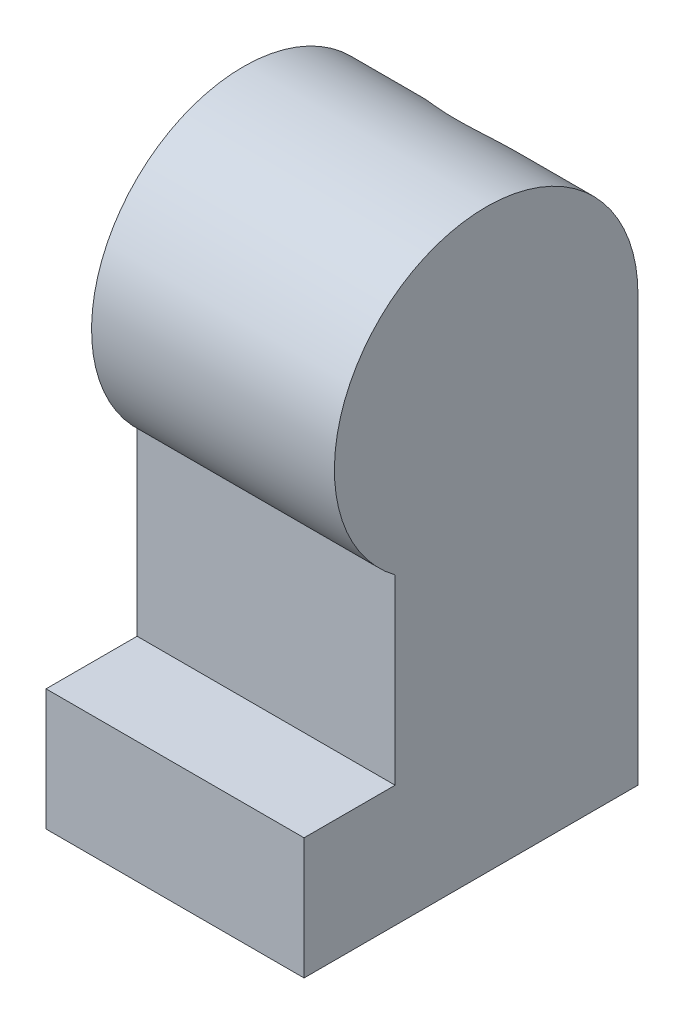
ISO-10303-21;
HEADER;
FILE_DESCRIPTION(('STEP AP214'),'2;1');
FILE_NAME('part.step','',(''),(''),'','','');
FILE_SCHEMA(('AUTOMOTIVE_DESIGN { 1 0 10303 214 1 1 1 1 }'));
ENDSEC;
DATA;
#1=APPLICATION_CONTEXT('core data for automotive mechanical design processes');
#2=APPLICATION_PROTOCOL_DEFINITION('international standard','automotive_design',2000,#1);
#3=PRODUCT_CONTEXT('',#1,'mechanical');
#4=PRODUCT('Part','Part','',(#3));
#5=PRODUCT_RELATED_PRODUCT_CATEGORY('part','',(#4));
#6=PRODUCT_DEFINITION_FORMATION('','',#4);
#7=PRODUCT_DEFINITION_CONTEXT('part definition',#1,'design');
#8=PRODUCT_DEFINITION('design','',#6,#7);
#9=PRODUCT_DEFINITION_SHAPE('','',#8);
#10=(LENGTH_UNIT() NAMED_UNIT(*) SI_UNIT(.MILLI.,.METRE.));
#11=(NAMED_UNIT(*) PLANE_ANGLE_UNIT() SI_UNIT($,.RADIAN.));
#12=(NAMED_UNIT(*) SI_UNIT($,.STERADIAN.) SOLID_ANGLE_UNIT());
#13=UNCERTAINTY_MEASURE_WITH_UNIT(LENGTH_MEASURE(1.E-05),#10,'distance_accuracy_value','');
#14=(GEOMETRIC_REPRESENTATION_CONTEXT(3) GLOBAL_UNCERTAINTY_ASSIGNED_CONTEXT((#13)) GLOBAL_UNIT_ASSIGNED_CONTEXT((#10,
#11,#12)) REPRESENTATION_CONTEXT('',''));
#15=CARTESIAN_POINT('',(0.,0.,0.));
#16=DIRECTION('',(0.,0.,1.));
#17=DIRECTION('',(1.,0.,0.));
#18=AXIS2_PLACEMENT_3D('',#15,#16,#17);
#19=CARTESIAN_POINT('',(1.190625,15.08325,-2.38125));
#20=DIRECTION('',(0.,0.,1.));
#21=DIRECTION('',(1.,0.,0.));
#22=AXIS2_PLACEMENT_3D('',#19,#20,#21);
#23=PLANE('',#22);
#24=DIRECTION('',(0.,1.,0.));
#25=VECTOR('',#24,1.);
#26=CARTESIAN_POINT('',(2.778125,9.66118596973271,-2.38125));
#27=LINE('',#26,#25);
#28=CARTESIAN_POINT('',(2.778125,9.66118596973271,-2.38125));
#29=VERTEX_POINT('',#28);
#30=CARTESIAN_POINT('',(2.778125,14.1513140302673,-2.38125));
#31=VERTEX_POINT('',#30);
#32=EDGE_CURVE('E167',#29,#31,#27,.T.);
#33=ORIENTED_EDGE('',*,*,#32,.F.);
#34=CARTESIAN_POINT('',(3.571875,11.90625,-2.38125));
#35=DIRECTION('',(0.,0.,1.));
#36=DIRECTION('',(1.,0.,0.));
#37=AXIS2_PLACEMENT_3D('',#34,#35,#36);
#38=CIRCLE('',#37,2.38125000000001);
#39=EDGE_CURVE('E161',#29,#31,#38,.F.);
#40=ORIENTED_EDGE('',*,*,#39,.T.);
#41=EDGE_LOOP('',(#33,#40));
#42=FACE_BOUND('',#41,.T.);
#43=ADVANCED_FACE('F37',(#42),#23,.F.);
#44=CARTESIAN_POINT('',(1.190625,15.08325,-2.38125));
#45=DIRECTION('',(0.,0.,1.));
#46=DIRECTION('',(1.,0.,0.));
#47=AXIS2_PLACEMENT_3D('',#44,#45,#46);
#48=PLANE('',#47);
#49=CARTESIAN_POINT('',(3.571875,3.96875,-2.38125));
#50=DIRECTION('',(0.,0.,1.));
#51=DIRECTION('',(1.,0.,0.));
#52=AXIS2_PLACEMENT_3D('',#49,#50,#51);
#53=CIRCLE('',#52,2.38125);
#54=CARTESIAN_POINT('',(5.953125,3.96875,-2.38125));
#55=VERTEX_POINT('',#54);
#56=CARTESIAN_POINT('',(1.190625,3.96875,-2.38125));
#57=VERTEX_POINT('',#56);
#58=EDGE_CURVE('E12',#55,#57,#53,.T.);
#59=ORIENTED_EDGE('',*,*,#58,.F.);
#60=DIRECTION('',(0.,-1.,0.));
#61=VECTOR('',#60,1.);
#62=CARTESIAN_POINT('',(5.953125,15.08325,-2.38125));
#63=LINE('',#62,#61);
#64=CARTESIAN_POINT('',(5.953125,7.67546167873052,-2.38125000000001));
#65=VERTEX_POINT('',#64);
#66=EDGE_CURVE('E251',#65,#55,#63,.T.);
#67=ORIENTED_EDGE('',*,*,#66,.F.);
#68=DIRECTION('',(1.,0.,0.));
#69=VECTOR('',#68,1.);
#70=CARTESIAN_POINT('',(-10.8284451513364,7.67546167873052,-2.38125000000001));
#71=LINE('',#70,#69);
#72=CARTESIAN_POINT('',(1.190625,7.67546167873052,-2.38125));
#73=VERTEX_POINT('',#72);
#74=EDGE_CURVE('E192',#73,#65,#71,.T.);
#75=ORIENTED_EDGE('',*,*,#74,.F.);
#76=DIRECTION('',(0.,-1.,0.));
#77=VECTOR('',#76,1.);
#78=CARTESIAN_POINT('',(1.190625,15.08325,-2.38125));
#79=LINE('',#78,#77);
#80=EDGE_CURVE('E282',#73,#57,#79,.T.);
#81=ORIENTED_EDGE('',*,*,#80,.T.);
#82=EDGE_LOOP('',(#59,#67,#75,#81));
#83=FACE_BOUND('',#82,.T.);
#84=ADVANCED_FACE('F206',(#83),#48,.T.);
#85=CARTESIAN_POINT('',(-11.2253201513364,11.1125,-0.396874999999999));
#86=DIRECTION('',(1.,0.,0.));
#87=DIRECTION('',(0.,0.,-1.));
#88=AXIS2_PLACEMENT_3D('',#85,#86,#87);
#89=CYLINDRICAL_SURFACE('',#88,3.96875);
#90=CARTESIAN_POINT('',(1.32681096973271,11.1125,-4.365625));
#91=CARTESIAN_POINT('',(1.30701755525374,11.1684542487782,-4.36563495142378));
#92=CARTESIAN_POINT('',(1.28933418573402,11.2251567426196,-4.36444187589844));
#93=CARTESIAN_POINT('',(1.25826719656662,11.339615668586,-4.35953264570903));
#94=CARTESIAN_POINT('',(1.2448832691343,11.3973720249551,-4.3558166717113));
#95=CARTESIAN_POINT('',(1.22253803103019,11.5132653525563,-4.34576537472123));
#96=CARTESIAN_POINT('',(1.21355875029495,11.5713997800275,-4.33944089181621));
#97=CARTESIAN_POINT('',(1.19994008150046,11.68780993877,-4.32414497095028));
#98=CARTESIAN_POINT('',(1.19530050429691,11.7460856637718,-4.31517364837326));
#99=CARTESIAN_POINT('',(1.18783402252553,11.9205011039694,-4.28428932674348));
#100=CARTESIAN_POINT('',(1.19144682230573,12.0362954200456,-4.25840032621934));
#101=CARTESIAN_POINT('',(1.21480133281904,12.2635264169128,-4.19687828490391));
#102=CARTESIAN_POINT('',(1.23455316803175,12.3749603162937,-4.1612391369035));
#103=CARTESIAN_POINT('',(1.28945780546674,12.594878206545,-4.08031480120449));
#104=CARTESIAN_POINT('',(1.32512164870348,12.7031253464996,-4.03473759885851));
#105=CARTESIAN_POINT('',(1.40995842608976,12.910772929603,-3.93670525741914));
#106=CARTESIAN_POINT('',(1.45913444185718,13.0101713478367,-3.884248550798));
#107=CARTESIAN_POINT('',(1.57850828121833,13.2151339018736,-3.76528729185824));
#108=CARTESIAN_POINT('',(1.65084913136497,13.3189326446407,-3.69790269036965));
#109=CARTESIAN_POINT('',(1.8097757049671,13.5128380361569,-3.55971381274583));
#110=CARTESIAN_POINT('',(1.89639328803208,13.6029131743021,-3.48890214433307));
#111=CARTESIAN_POINT('',(2.04503270465009,13.7350768823537,-3.37635143782159));
#112=CARTESIAN_POINT('',(2.1028373332676,13.7818412968881,-3.33443489445976));
#113=CARTESIAN_POINT('',(2.22314076494899,13.8701336363607,-3.25171092436964));
#114=CARTESIAN_POINT('',(2.28564167761434,13.911659185256,-3.2109040074379));
#115=CARTESIAN_POINT('',(2.41522685178416,13.98908449684,-3.13170532815867));
#116=CARTESIAN_POINT('',(2.48229935284518,14.0249979664163,-3.09330782298671));
#117=CARTESIAN_POINT('',(2.62123402300634,14.0908637875129,-3.02037206915601));
#118=CARTESIAN_POINT('',(2.69309124281277,14.1208221748982,-2.98582992857089));
#119=CARTESIAN_POINT('',(2.8475670512362,14.1762671053601,-2.9200281156823));
#120=CARTESIAN_POINT('',(2.93058753935312,14.2012168561875,-2.88924005750429));
#121=CARTESIAN_POINT('',(3.10166067161263,14.2422625358819,-2.83750297370962));
#122=CARTESIAN_POINT('',(3.18970215569316,14.2583773156041,-2.8165330136554));
#123=CARTESIAN_POINT('',(3.37018005290364,14.2806970263171,-2.78724525807482));
#124=CARTESIAN_POINT('',(3.46265288221283,14.2867962238212,-2.77906249883042));
#125=CARTESIAN_POINT('',(3.64782240088153,14.2880875326372,-2.77734248857693));
#126=CARTESIAN_POINT('',(3.74051907887779,14.283280186437,-2.78380450914133));
#127=CARTESIAN_POINT('',(3.9119398229629,14.2644843582118,-2.80854588253211));
#128=CARTESIAN_POINT('',(3.99102190241361,14.2516462481256,-2.82534073482566));
#129=CARTESIAN_POINT('',(4.14536649071659,14.2187583541195,-2.86726909307836));
#130=CARTESIAN_POINT('',(4.22062549115162,14.1987020778502,-2.89241010437086));
#131=CARTESIAN_POINT('',(4.41491912867954,14.1369086837694,-2.96739228283316));
#132=CARTESIAN_POINT('',(4.53009220373622,14.089596197385,-3.02258860505556));
#133=CARTESIAN_POINT('',(4.7484218209142,13.9801551686941,-3.14170959287202));
#134=CARTESIAN_POINT('',(4.85153633106603,13.9179769750056,-3.20566319517299));
#135=CARTESIAN_POINT('',(5.01113575176531,13.8048570233376,-3.3133696473234));
#136=CARTESIAN_POINT('',(5.07110844847499,13.7578494344151,-3.35616718956509));
#137=CARTESIAN_POINT('',(5.18615961786883,13.6584557082274,-3.44210253914183));
#138=CARTESIAN_POINT('',(5.24123664209993,13.6060679889914,-3.48524044309471));
#139=CARTESIAN_POINT('',(5.3987969941357,13.4411122764214,-3.61368535655438));
#140=CARTESIAN_POINT('',(5.49387346962105,13.3205644315129,-3.69820896743568));
#141=CARTESIAN_POINT('',(5.64558468177028,13.0835635829583,-3.84384143135618));
#142=CARTESIAN_POINT('',(5.70607404999784,12.9704414438622,-3.90639638612007));
#143=CARTESIAN_POINT('',(5.809146855791,12.7319391129767,-4.02259929427164));
#144=CARTESIAN_POINT('',(5.85174641472338,12.6065700835947,-4.0762552404816));
#145=CARTESIAN_POINT('',(5.9000444298798,12.4108054268426,-4.14791656174465));
#146=CARTESIAN_POINT('',(5.91357250663917,12.3438963897962,-4.17042700331695));
#147=CARTESIAN_POINT('',(5.93490653945093,12.2081513519553,-4.21204852034721));
#148=CARTESIAN_POINT('',(5.9427157240873,12.1393164612206,-4.23116150920455));
#149=CARTESIAN_POINT('',(5.9522831482818,12.0003538391527,-4.26570110143064));
#150=CARTESIAN_POINT('',(5.95404522641276,11.9302269563855,-4.28113003756639));
#151=CARTESIAN_POINT('',(5.9512989945741,11.7893928936788,-4.30813263003261));
#152=CARTESIAN_POINT('',(5.94679319797398,11.7186859576363,-4.31970782937556));
#153=CARTESIAN_POINT('',(5.92919483451744,11.5574140038843,-4.34166513075442));
#154=CARTESIAN_POINT('',(5.91403523758213,11.4668847895153,-4.35078531060102));
#155=CARTESIAN_POINT('',(5.88345670776998,11.3326119670545,-4.35977224461627));
#156=CARTESIAN_POINT('',(5.87194857599804,11.2880830053145,-4.36198558791466));
#157=CARTESIAN_POINT('',(5.84636132242703,11.1997253376775,-4.36491246473769));
#158=CARTESIAN_POINT('',(5.83228251038636,11.1558965481034,-4.36562617883319));
#159=CARTESIAN_POINT('',(5.81693903026729,11.1125,-4.365625));
#160=B_SPLINE_CURVE_WITH_KNOTS('',3,(#90,#91,#92,#93,#94,#95,#96,#97,#98,#99,#100,#101,#102,
#103,#104,#105,#106,#107,#108,#109,#110,#111,#112,#113,#114,#115,#116,#117,#118,#119,#120,#121,
#122,#123,#124,#125,#126,#127,#128,#129,#130,#131,#132,#133,#134,#135,#136,#137,#138,#139,#140,
#141,#142,#143,#144,#145,#146,#147,#148,#149,#150,#151,#152,#153,#154,#155,#156,#157,#158,#159),
.UNSPECIFIED.,.F.,.F.,(4,2,2,2,2,2,2,2,2,2,2,2,2,2,2,2,2,2,2,2,2,2,2,2,2,2,2,2,2,2,2,2,2,2,4),
(0.,0.178003936551981,0.355995127474543,0.533253982525169,0.710505111457348,1.06480679321033,
1.4193309093656,1.78616738421233,2.15308759018841,2.58159393935689,3.01106981153157,
3.2668813061563,3.52280840797637,3.77810032248523,4.03313214757179,4.30821568372511,
4.58270997704483,4.86008387357856,5.13744397392907,5.38207395783397,5.62692452531978,
6.03324709638796,6.44094622281295,6.70283852114437,6.96480804783826,7.48764136400289,
7.91423378942165,8.3404409626894,8.55579968810129,8.77103673944507,8.98613713765132,
9.20115130711372,9.47693752858245,9.614987519328,9.75302088647394),.UNSPECIFIED.);
#161=CARTESIAN_POINT('',(1.32681096973271,11.1125,-4.365625));
#162=VERTEX_POINT('',#161);
#163=CARTESIAN_POINT('',(5.81693903026729,11.1125,-4.365625));
#164=VERTEX_POINT('',#163);
#165=EDGE_CURVE('E59',#162,#164,#160,.T.);
#166=ORIENTED_EDGE('',*,*,#165,.F.);
#167=DIRECTION('',(-1.,0.,0.));
#168=VECTOR('',#167,1.);
#169=CARTESIAN_POINT('',(6.746875,11.1125,-4.365625));
#170=LINE('',#169,#168);
#171=CARTESIAN_POINT('',(0.396874999999998,11.1125,-4.365625));
#172=VERTEX_POINT('',#171);
#173=EDGE_CURVE('E348',#162,#172,#170,.T.);
#174=ORIENTED_EDGE('',*,*,#173,.T.);
#175=CARTESIAN_POINT('',(0.396875,11.1125,-0.396874999999999));
#176=DIRECTION('',(-1.,0.,0.));
#177=DIRECTION('',(0.,0.,1.));
#178=AXIS2_PLACEMENT_3D('',#175,#176,#177);
#179=CIRCLE('',#178,3.96875);
#180=CARTESIAN_POINT('',(0.396875,7.9375,1.984375));
#181=VERTEX_POINT('',#180);
#182=EDGE_CURVE('E45',#172,#181,#179,.F.);
#183=ORIENTED_EDGE('',*,*,#182,.T.);
#184=DIRECTION('',(1.,0.,0.));
#185=VECTOR('',#184,1.);
#186=CARTESIAN_POINT('',(-11.2253201513364,7.9375,1.984375));
#187=LINE('',#186,#185);
#188=CARTESIAN_POINT('',(6.746875,7.9375,1.984375));
#189=VERTEX_POINT('',#188);
#190=EDGE_CURVE('E310',#189,#181,#187,.F.);
#191=ORIENTED_EDGE('',*,*,#190,.F.);
#192=CARTESIAN_POINT('',(6.746875,11.1125,-0.396874999999999));
#193=DIRECTION('',(1.,0.,0.));
#194=DIRECTION('',(0.,0.,-1.));
#195=AXIS2_PLACEMENT_3D('',#192,#193,#194);
#196=CIRCLE('',#195,3.96875);
#197=CARTESIAN_POINT('',(6.746875,11.1125,-4.365625));
#198=VERTEX_POINT('',#197);
#199=EDGE_CURVE('E303',#198,#189,#196,.T.);
#200=ORIENTED_EDGE('',*,*,#199,.F.);
#201=EDGE_CURVE('E344',#198,#164,#170,.T.);
#202=ORIENTED_EDGE('',*,*,#201,.T.);
#203=EDGE_LOOP('',(#166,#174,#183,#191,#200,#202));
#204=FACE_BOUND('',#203,.T.);
#205=ADVANCED_FACE('F194',(#204),#89,.T.);
#206=CARTESIAN_POINT('',(6.746875,0.,4.365625));
#207=DIRECTION('',(0.,1.,0.));
#208=DIRECTION('',(0.,0.,1.));
#209=AXIS2_PLACEMENT_3D('',#206,#207,#208);
#210=PLANE('',#209);
#211=DIRECTION('',(1.,0.,0.));
#212=VECTOR('',#211,1.);
#213=CARTESIAN_POINT('',(5.953125,0.,2.38125));
#214=LINE('',#213,#212);
#215=CARTESIAN_POINT('',(1.190625,0.,2.38125));
#216=VERTEX_POINT('',#215);
#217=CARTESIAN_POINT('',(5.953125,0.,2.38125));
#218=VERTEX_POINT('',#217);
#219=EDGE_CURVE('E274',#216,#218,#214,.T.);
#220=ORIENTED_EDGE('',*,*,#219,.T.);
#221=DIRECTION('',(0.,0.,-1.));
#222=VECTOR('',#221,1.);
#223=CARTESIAN_POINT('',(5.953125,0.,0.));
#224=LINE('',#223,#222);
#225=CARTESIAN_POINT('',(5.953125,0.,-2.38125));
#226=VERTEX_POINT('',#225);
#227=EDGE_CURVE('E273',#218,#226,#224,.T.);
#228=ORIENTED_EDGE('',*,*,#227,.T.);
#229=DIRECTION('',(-1.,0.,0.));
#230=VECTOR('',#229,1.);
#231=CARTESIAN_POINT('',(1.190625,0.,-2.38125));
#232=LINE('',#231,#230);
#233=CARTESIAN_POINT('',(1.190625,0.,-2.38125));
#234=VERTEX_POINT('',#233);
#235=EDGE_CURVE('E270',#226,#234,#232,.T.);
#236=ORIENTED_EDGE('',*,*,#235,.T.);
#237=DIRECTION('',(0.,0.,1.));
#238=VECTOR('',#237,1.);
#239=CARTESIAN_POINT('',(1.190625,0.,2.38125));
#240=LINE('',#239,#238);
#241=EDGE_CURVE('E277',#234,#216,#240,.T.);
#242=ORIENTED_EDGE('',*,*,#241,.T.);
#243=EDGE_LOOP('',(#220,#228,#236,#242));
#244=FACE_BOUND('',#243,.T.);
#245=DIRECTION('',(0.,0.,-1.));
#246=VECTOR('',#245,1.);
#247=CARTESIAN_POINT('',(0.,0.,4.365625));
#248=LINE('',#247,#246);
#249=CARTESIAN_POINT('',(0.,0.,4.365625));
#250=VERTEX_POINT('',#249);
#251=CARTESIAN_POINT('',(0.,0.,-4.365625));
#252=VERTEX_POINT('',#251);
#253=EDGE_CURVE('E330',#250,#252,#248,.T.);
#254=ORIENTED_EDGE('',*,*,#253,.T.);
#255=DIRECTION('',(-1.,0.,0.));
#256=VECTOR('',#255,1.);
#257=CARTESIAN_POINT('',(6.746875,0.,-4.365625));
#258=LINE('',#257,#256);
#259=CARTESIAN_POINT('',(6.746875,0.,-4.365625));
#260=VERTEX_POINT('',#259);
#261=EDGE_CURVE('E347',#260,#252,#258,.T.);
#262=ORIENTED_EDGE('',*,*,#261,.F.);
#263=DIRECTION('',(0.,0.,-1.));
#264=VECTOR('',#263,1.);
#265=CARTESIAN_POINT('',(6.746875,0.,4.365625));
#266=LINE('',#265,#264);
#267=CARTESIAN_POINT('',(6.746875,0.,4.365625));
#268=VERTEX_POINT('',#267);
#269=EDGE_CURVE('E317',#268,#260,#266,.T.);
#270=ORIENTED_EDGE('',*,*,#269,.F.);
#271=DIRECTION('',(-1.,0.,0.));
#272=VECTOR('',#271,1.);
#273=CARTESIAN_POINT('',(6.746875,0.,4.365625));
#274=LINE('',#273,#272);
#275=EDGE_CURVE('E351',#268,#250,#274,.T.);
#276=ORIENTED_EDGE('',*,*,#275,.T.);
#277=EDGE_LOOP('',(#254,#262,#270,#276));
#278=FACE_BOUND('',#277,.T.);
#279=ADVANCED_FACE('F380',(#244,#278),#210,.F.);
#280=CARTESIAN_POINT('',(6.746875,0.,4.365625));
#281=DIRECTION('',(0.,0.,-1.));
#282=DIRECTION('',(-1.,0.,0.));
#283=AXIS2_PLACEMENT_3D('',#280,#281,#282);
#284=PLANE('',#283);
#285=DIRECTION('',(0.,-1.,0.));
#286=VECTOR('',#285,1.);
#287=CARTESIAN_POINT('',(0.,0.,4.365625));
#288=LINE('',#287,#286);
#289=CARTESIAN_POINT('',(0.,3.175,4.365625));
#290=VERTEX_POINT('',#289);
#291=EDGE_CURVE('E313',#290,#250,#288,.T.);
#292=ORIENTED_EDGE('',*,*,#291,.T.);
#293=ORIENTED_EDGE('',*,*,#275,.F.);
#294=DIRECTION('',(0.,-1.,0.));
#295=VECTOR('',#294,1.);
#296=CARTESIAN_POINT('',(6.746875,0.,4.365625));
#297=LINE('',#296,#295);
#298=CARTESIAN_POINT('',(6.746875,3.175,4.365625));
#299=VERTEX_POINT('',#298);
#300=EDGE_CURVE('E314',#299,#268,#297,.T.);
#301=ORIENTED_EDGE('',*,*,#300,.F.);
#302=DIRECTION('',(-1.,0.,0.));
#303=VECTOR('',#302,1.);
#304=CARTESIAN_POINT('',(6.746875,3.175,4.365625));
#305=LINE('',#304,#303);
#306=EDGE_CURVE('E327',#299,#290,#305,.T.);
#307=ORIENTED_EDGE('',*,*,#306,.T.);
#308=EDGE_LOOP('',(#292,#293,#301,#307));
#309=FACE_BOUND('',#308,.T.);
#310=ADVANCED_FACE('F39',(#309),#284,.F.);
#311=CARTESIAN_POINT('',(6.746875,11.1125,-4.365625));
#312=DIRECTION('',(0.,0.,1.));
#313=DIRECTION('',(0.,-1.,0.));
#314=AXIS2_PLACEMENT_3D('',#311,#312,#313);
#315=PLANE('',#314);
#316=CARTESIAN_POINT('',(3.571875,3.96875,-4.365625));
#317=DIRECTION('',(0.,0.,-1.));
#318=DIRECTION('',(0.,1.,0.));
#319=AXIS2_PLACEMENT_3D('',#316,#317,#318);
#320=CIRCLE('',#319,2.38125);
#321=CARTESIAN_POINT('',(3.571875,6.35,-4.365625));
#322=VERTEX_POINT('',#321);
#323=EDGE_CURVE('E177',#322,#322,#320,.T.);
#324=ORIENTED_EDGE('',*,*,#323,.F.);
#325=EDGE_LOOP('',(#324));
#326=FACE_BOUND('',#325,.T.);
#327=ORIENTED_EDGE('',*,*,#173,.F.);
#328=CARTESIAN_POINT('',(3.571875,11.90625,-4.365625));
#329=DIRECTION('',(0.,0.,-1.));
#330=DIRECTION('',(0.,1.,0.));
#331=AXIS2_PLACEMENT_3D('',#328,#329,#330);
#332=CIRCLE('',#331,2.38125000000001);
#333=EDGE_CURVE('E175',#164,#162,#332,.T.);
#334=ORIENTED_EDGE('',*,*,#333,.F.);
#335=ORIENTED_EDGE('',*,*,#201,.F.);
#336=DIRECTION('',(0.,1.,0.));
#337=VECTOR('',#336,1.);
#338=CARTESIAN_POINT('',(6.746875,11.1125,-4.365625));
#339=LINE('',#338,#337);
#340=EDGE_CURVE('E320',#260,#198,#339,.T.);
#341=ORIENTED_EDGE('',*,*,#340,.F.);
#342=ORIENTED_EDGE('',*,*,#261,.T.);
#343=DIRECTION('',(0.,1.,0.));
#344=VECTOR('',#343,1.);
#345=CARTESIAN_POINT('',(0.,11.1125,-4.365625));
#346=LINE('',#345,#344);
#347=CARTESIAN_POINT('',(0.,11.1125,-4.365625));
#348=VERTEX_POINT('',#347);
#349=EDGE_CURVE('E332',#252,#348,#346,.T.);
#350=ORIENTED_EDGE('',*,*,#349,.T.);
#351=EDGE_CURVE('E343',#172,#348,#170,.T.);
#352=ORIENTED_EDGE('',*,*,#351,.F.);
#353=EDGE_LOOP('',(#327,#334,#335,#341,#342,#350,#352));
#354=FACE_BOUND('',#353,.T.);
#355=ADVANCED_FACE('F372',(#326,#354),#315,.F.);
#356=CARTESIAN_POINT('',(6.746875,3.175,1.984375));
#357=DIRECTION('',(0.,0.,-1.));
#358=DIRECTION('',(-1.,0.,0.));
#359=AXIS2_PLACEMENT_3D('',#356,#357,#358);
#360=PLANE('',#359);
#361=DIRECTION('',(0.,-1.,0.));
#362=VECTOR('',#361,1.);
#363=CARTESIAN_POINT('',(6.746875,3.175,1.984375));
#364=LINE('',#363,#362);
#365=CARTESIAN_POINT('',(6.746875,3.175,1.984375));
#366=VERTEX_POINT('',#365);
#367=EDGE_CURVE('E323',#189,#366,#364,.T.);
#368=ORIENTED_EDGE('',*,*,#367,.F.);
#369=ORIENTED_EDGE('',*,*,#190,.T.);
#370=CARTESIAN_POINT('',(0.,7.9375,1.984375));
#371=VERTEX_POINT('',#370);
#372=EDGE_CURVE('E309',#181,#371,#187,.F.);
#373=ORIENTED_EDGE('',*,*,#372,.T.);
#374=DIRECTION('',(0.,-1.,0.));
#375=VECTOR('',#374,1.);
#376=CARTESIAN_POINT('',(0.,3.175,1.984375));
#377=LINE('',#376,#375);
#378=CARTESIAN_POINT('',(0.,3.175,1.984375));
#379=VERTEX_POINT('',#378);
#380=EDGE_CURVE('E335',#371,#379,#377,.T.);
#381=ORIENTED_EDGE('',*,*,#380,.T.);
#382=DIRECTION('',(-1.,0.,0.));
#383=VECTOR('',#382,1.);
#384=CARTESIAN_POINT('',(6.746875,3.175,1.984375));
#385=LINE('',#384,#383);
#386=EDGE_CURVE('E340',#366,#379,#385,.T.);
#387=ORIENTED_EDGE('',*,*,#386,.F.);
#388=EDGE_LOOP('',(#368,#369,#373,#381,#387));
#389=FACE_BOUND('',#388,.T.);
#390=ADVANCED_FACE('F361',(#389),#360,.F.);
#391=CARTESIAN_POINT('',(6.746875,3.175,4.365625));
#392=DIRECTION('',(0.,-1.,0.));
#393=DIRECTION('',(0.,0.,-1.));
#394=AXIS2_PLACEMENT_3D('',#391,#392,#393);
#395=PLANE('',#394);
#396=DIRECTION('',(0.,0.,1.));
#397=VECTOR('',#396,1.);
#398=CARTESIAN_POINT('',(0.,3.175,4.365625));
#399=LINE('',#398,#397);
#400=EDGE_CURVE('E318',#379,#290,#399,.T.);
#401=ORIENTED_EDGE('',*,*,#400,.T.);
#402=ORIENTED_EDGE('',*,*,#306,.F.);
#403=DIRECTION('',(0.,0.,1.));
#404=VECTOR('',#403,1.);
#405=CARTESIAN_POINT('',(6.746875,3.175,4.365625));
#406=LINE('',#405,#404);
#407=EDGE_CURVE('E325',#366,#299,#406,.T.);
#408=ORIENTED_EDGE('',*,*,#407,.F.);
#409=ORIENTED_EDGE('',*,*,#386,.T.);
#410=EDGE_LOOP('',(#401,#402,#408,#409));
#411=FACE_BOUND('',#410,.T.);
#412=ADVANCED_FACE('F386',(#411),#395,.F.);
#413=CARTESIAN_POINT('',(6.746875,0.,0.));
#414=DIRECTION('',(-1.,0.,0.));
#415=DIRECTION('',(0.,0.,1.));
#416=AXIS2_PLACEMENT_3D('',#413,#414,#415);
#417=PLANE('',#416);
#418=ORIENTED_EDGE('',*,*,#340,.T.);
#419=ORIENTED_EDGE('',*,*,#199,.T.);
#420=ORIENTED_EDGE('',*,*,#367,.T.);
#421=ORIENTED_EDGE('',*,*,#407,.T.);
#422=ORIENTED_EDGE('',*,*,#300,.T.);
#423=ORIENTED_EDGE('',*,*,#269,.T.);
#424=EDGE_LOOP('',(#418,#419,#420,#421,#422,#423));
#425=FACE_BOUND('',#424,.T.);
#426=ADVANCED_FACE('F367',(#425),#417,.F.);
#427=CARTESIAN_POINT('',(0.,0.,0.));
#428=DIRECTION('',(-1.,0.,0.));
#429=DIRECTION('',(0.,0.,1.));
#430=AXIS2_PLACEMENT_3D('',#427,#428,#429);
#431=PLANE('',#430);
#432=CARTESIAN_POINT('',(0.,11.1125,-0.396874999999999));
#433=DIRECTION('',(-1.,0.,0.));
#434=DIRECTION('',(0.,0.,1.));
#435=AXIS2_PLACEMENT_3D('',#432,#433,#434);
#436=CIRCLE('',#435,3.96875);
#437=EDGE_CURVE('E264',#348,#371,#436,.T.);
#438=ORIENTED_EDGE('',*,*,#437,.F.);
#439=ORIENTED_EDGE('',*,*,#349,.F.);
#440=ORIENTED_EDGE('',*,*,#253,.F.);
#441=ORIENTED_EDGE('',*,*,#291,.F.);
#442=ORIENTED_EDGE('',*,*,#400,.F.);
#443=ORIENTED_EDGE('',*,*,#380,.F.);
#444=EDGE_LOOP('',(#438,#439,#440,#441,#442,#443));
#445=FACE_BOUND('',#444,.T.);
#446=ADVANCED_FACE('F237',(#445),#431,.T.);
#447=CARTESIAN_POINT('',(6.746875,3.175,1.190625));
#448=DIRECTION('',(0.,0.,-1.));
#449=DIRECTION('',(-1.,0.,0.));
#450=AXIS2_PLACEMENT_3D('',#447,#448,#449);
#451=PLANE('',#450);
#452=DIRECTION('',(1.,0.,0.));
#453=VECTOR('',#452,1.);
#454=CARTESIAN_POINT('',(-10.8284451513364,7.4750805421288,1.190625));
#455=LINE('',#454,#453);
#456=CARTESIAN_POINT('',(5.953125,7.4750805421288,1.190625));
#457=VERTEX_POINT('',#456);
#458=CARTESIAN_POINT('',(1.190625,7.4750805421288,1.190625));
#459=VERTEX_POINT('',#458);
#460=EDGE_CURVE('E255',#457,#459,#455,.F.);
#461=ORIENTED_EDGE('',*,*,#460,.F.);
#462=DIRECTION('',(0.,-1.,0.));
#463=VECTOR('',#462,1.);
#464=CARTESIAN_POINT('',(5.953125,0.,1.190625));
#465=LINE('',#464,#463);
#466=CARTESIAN_POINT('',(5.953125,2.38125,1.190625));
#467=VERTEX_POINT('',#466);
#468=EDGE_CURVE('E253',#457,#467,#465,.T.);
#469=ORIENTED_EDGE('',*,*,#468,.T.);
#470=DIRECTION('',(-1.,0.,0.));
#471=VECTOR('',#470,1.);
#472=CARTESIAN_POINT('',(6.746875,2.38125,1.190625));
#473=LINE('',#472,#471);
#474=CARTESIAN_POINT('',(1.190625,2.38125,1.190625));
#475=VERTEX_POINT('',#474);
#476=EDGE_CURVE('E300',#467,#475,#473,.T.);
#477=ORIENTED_EDGE('',*,*,#476,.T.);
#478=DIRECTION('',(0.,1.,0.));
#479=VECTOR('',#478,1.);
#480=CARTESIAN_POINT('',(1.190625,15.08325,1.190625));
#481=LINE('',#480,#479);
#482=EDGE_CURVE('E292',#475,#459,#481,.T.);
#483=ORIENTED_EDGE('',*,*,#482,.T.);
#484=EDGE_LOOP('',(#461,#469,#477,#483));
#485=FACE_BOUND('',#484,.T.);
#486=ADVANCED_FACE('F233',(#485),#451,.T.);
#487=CARTESIAN_POINT('',(6.746875,2.38125,4.365625));
#488=DIRECTION('',(0.,-1.,0.));
#489=DIRECTION('',(0.,0.,-1.));
#490=AXIS2_PLACEMENT_3D('',#487,#488,#489);
#491=PLANE('',#490);
#492=DIRECTION('',(-1.,0.,0.));
#493=VECTOR('',#492,1.);
#494=CARTESIAN_POINT('',(5.953125,2.38125,2.38125));
#495=LINE('',#494,#493);
#496=CARTESIAN_POINT('',(5.953125,2.38125,2.38125));
#497=VERTEX_POINT('',#496);
#498=CARTESIAN_POINT('',(1.190625,2.38125,2.38125));
#499=VERTEX_POINT('',#498);
#500=EDGE_CURVE('E269',#497,#499,#495,.T.);
#501=ORIENTED_EDGE('',*,*,#500,.T.);
#502=DIRECTION('',(0.,0.,-1.));
#503=VECTOR('',#502,1.);
#504=CARTESIAN_POINT('',(1.190625,2.38125,2.38125));
#505=LINE('',#504,#503);
#506=EDGE_CURVE('E289',#499,#475,#505,.T.);
#507=ORIENTED_EDGE('',*,*,#506,.T.);
#508=ORIENTED_EDGE('',*,*,#476,.F.);
#509=DIRECTION('',(0.,0.,1.));
#510=VECTOR('',#509,1.);
#511=CARTESIAN_POINT('',(5.953125,2.38125,0.));
#512=LINE('',#511,#510);
#513=EDGE_CURVE('E297',#467,#497,#512,.T.);
#514=ORIENTED_EDGE('',*,*,#513,.T.);
#515=EDGE_LOOP('',(#501,#507,#508,#514));
#516=FACE_BOUND('',#515,.T.);
#517=ADVANCED_FACE('F236',(#516),#491,.T.);
#518=CARTESIAN_POINT('',(5.953125,0.,0.));
#519=DIRECTION('',(-1.,0.,0.));
#520=DIRECTION('',(0.,0.,1.));
#521=AXIS2_PLACEMENT_3D('',#518,#519,#520);
#522=PLANE('',#521);
#523=CARTESIAN_POINT('',(5.953125,11.1125,-0.396874999999999));
#524=DIRECTION('',(-1.,0.,0.));
#525=DIRECTION('',(0.,0.,1.));
#526=AXIS2_PLACEMENT_3D('',#523,#524,#525);
#527=CIRCLE('',#526,3.96875);
#528=EDGE_CURVE('E249',#65,#457,#527,.T.);
#529=ORIENTED_EDGE('',*,*,#528,.F.);
#530=ORIENTED_EDGE('',*,*,#66,.T.);
#531=EDGE_CURVE('E281',#55,#226,#63,.T.);
#532=ORIENTED_EDGE('',*,*,#531,.T.);
#533=ORIENTED_EDGE('',*,*,#227,.F.);
#534=DIRECTION('',(0.,-1.,0.));
#535=VECTOR('',#534,1.);
#536=CARTESIAN_POINT('',(5.953125,15.08325,2.38125));
#537=LINE('',#536,#535);
#538=EDGE_CURVE('E286',#497,#218,#537,.T.);
#539=ORIENTED_EDGE('',*,*,#538,.F.);
#540=ORIENTED_EDGE('',*,*,#513,.F.);
#541=ORIENTED_EDGE('',*,*,#468,.F.);
#542=EDGE_LOOP('',(#529,#530,#532,#533,#539,#540,#541));
#543=FACE_BOUND('',#542,.T.);
#544=ADVANCED_FACE('F225',(#543),#522,.T.);
#545=CARTESIAN_POINT('',(5.953125,15.08325,2.38125));
#546=DIRECTION('',(0.,0.,-1.));
#547=DIRECTION('',(0.,1.,0.));
#548=AXIS2_PLACEMENT_3D('',#545,#546,#547);
#549=PLANE('',#548);
#550=ORIENTED_EDGE('',*,*,#500,.F.);
#551=ORIENTED_EDGE('',*,*,#538,.T.);
#552=ORIENTED_EDGE('',*,*,#219,.F.);
#553=DIRECTION('',(0.,-1.,0.));
#554=VECTOR('',#553,1.);
#555=CARTESIAN_POINT('',(1.190625,15.08325,2.38125));
#556=LINE('',#555,#554);
#557=EDGE_CURVE('E284',#499,#216,#556,.T.);
#558=ORIENTED_EDGE('',*,*,#557,.F.);
#559=EDGE_LOOP('',(#550,#551,#552,#558));
#560=FACE_BOUND('',#559,.T.);
#561=ADVANCED_FACE('F221',(#560),#549,.T.);
#562=CARTESIAN_POINT('',(1.190625,15.08325,2.38125));
#563=DIRECTION('',(1.,0.,0.));
#564=DIRECTION('',(0.,0.,-1.));
#565=AXIS2_PLACEMENT_3D('',#562,#563,#564);
#566=PLANE('',#565);
#567=CARTESIAN_POINT('',(1.190625,11.1125,-0.396874999999999));
#568=DIRECTION('',(1.,0.,0.));
#569=DIRECTION('',(0.,0.,-1.));
#570=AXIS2_PLACEMENT_3D('',#567,#568,#569);
#571=CIRCLE('',#570,3.96875);
#572=EDGE_CURVE('E256',#459,#73,#571,.T.);
#573=ORIENTED_EDGE('',*,*,#572,.F.);
#574=ORIENTED_EDGE('',*,*,#482,.F.);
#575=ORIENTED_EDGE('',*,*,#506,.F.);
#576=ORIENTED_EDGE('',*,*,#557,.T.);
#577=ORIENTED_EDGE('',*,*,#241,.F.);
#578=EDGE_CURVE('E285',#57,#234,#79,.T.);
#579=ORIENTED_EDGE('',*,*,#578,.F.);
#580=ORIENTED_EDGE('',*,*,#80,.F.);
#581=EDGE_LOOP('',(#573,#574,#575,#576,#577,#579,#580));
#582=FACE_BOUND('',#581,.T.);
#583=ADVANCED_FACE('F224',(#582),#566,.T.);
#584=CARTESIAN_POINT('',(3.571875,3.96875,-2.38125));
#585=DIRECTION('',(0.,0.,1.));
#586=DIRECTION('',(1.,0.,0.));
#587=AXIS2_PLACEMENT_3D('',#584,#585,#586);
#588=CIRCLE('',#587,2.38125);
#589=EDGE_CURVE('E180',#55,#57,#588,.F.);
#590=ORIENTED_EDGE('',*,*,#589,.T.);
#591=ORIENTED_EDGE('',*,*,#578,.T.);
#592=ORIENTED_EDGE('',*,*,#235,.F.);
#593=ORIENTED_EDGE('',*,*,#531,.F.);
#594=EDGE_LOOP('',(#590,#591,#592,#593));
#595=FACE_BOUND('',#594,.T.);
#596=ADVANCED_FACE('F219',(#595),#48,.T.);
#597=CARTESIAN_POINT('',(17.9721951513364,11.1125,-0.396874999999999));
#598=DIRECTION('',(-1.,0.,0.));
#599=DIRECTION('',(0.,0.,1.));
#600=AXIS2_PLACEMENT_3D('',#597,#598,#599);
#601=CYLINDRICAL_SURFACE('',#600,3.96875);
#602=ORIENTED_EDGE('',*,*,#351,.T.);
#603=ORIENTED_EDGE('',*,*,#437,.T.);
#604=ORIENTED_EDGE('',*,*,#372,.F.);
#605=CARTESIAN_POINT('',(0.396874999999998,11.1125,-0.396874999999999));
#606=DIRECTION('',(-1.,0.,0.));
#607=DIRECTION('',(0.,0.,1.));
#608=AXIS2_PLACEMENT_3D('',#605,#606,#607);
#609=CIRCLE('',#608,3.96875);
#610=EDGE_CURVE('E266',#181,#172,#609,.F.);
#611=ORIENTED_EDGE('',*,*,#610,.T.);
#612=EDGE_LOOP('',(#602,#603,#604,#611));
#613=FACE_BOUND('',#612,.T.);
#614=ADVANCED_FACE('F215',(#613),#601,.F.);
#615=CARTESIAN_POINT('',(0.396875,0.,0.));
#616=DIRECTION('',(-1.,0.,0.));
#617=DIRECTION('',(0.,0.,1.));
#618=AXIS2_PLACEMENT_3D('',#615,#616,#617);
#619=PLANE('',#618);
#620=CARTESIAN_POINT('',(0.396875,11.1125,-0.396874999999999));
#621=DIRECTION('',(-1.,0.,0.));
#622=DIRECTION('',(0.,0.,1.));
#623=AXIS2_PLACEMENT_3D('',#620,#621,#622);
#624=CIRCLE('',#623,1.190625);
#625=CARTESIAN_POINT('',(0.396875,11.1125,0.793750000000002));
#626=VERTEX_POINT('',#625);
#627=EDGE_CURVE('E586',#626,#626,#624,.T.);
#628=ORIENTED_EDGE('',*,*,#627,.F.);
#629=EDGE_LOOP('',(#628));
#630=FACE_BOUND('',#629,.T.);
#631=ORIENTED_EDGE('',*,*,#610,.F.);
#632=ORIENTED_EDGE('',*,*,#182,.F.);
#633=EDGE_LOOP('',(#631,#632));
#634=FACE_BOUND('',#633,.T.);
#635=ADVANCED_FACE('F211',(#630,#634),#619,.T.);
#636=CARTESIAN_POINT('',(-10.8284451513364,11.1125,-0.396874999999999));
#637=DIRECTION('',(1.,0.,0.));
#638=DIRECTION('',(0.,0.,-1.));
#639=AXIS2_PLACEMENT_3D('',#636,#637,#638);
#640=CYLINDRICAL_SURFACE('',#639,3.96875);
#641=ORIENTED_EDGE('',*,*,#528,.T.);
#642=ORIENTED_EDGE('',*,*,#460,.T.);
#643=ORIENTED_EDGE('',*,*,#572,.T.);
#644=ORIENTED_EDGE('',*,*,#74,.T.);
#645=EDGE_LOOP('',(#641,#642,#643,#644));
#646=FACE_BOUND('',#645,.T.);
#647=ADVANCED_FACE('F208',(#646),#640,.T.);
#648=CARTESIAN_POINT('',(3.571875,3.96875,4.35394209080188));
#649=DIRECTION('',(0.,0.,-1.));
#650=DIRECTION('',(0.,1.,0.));
#651=AXIS2_PLACEMENT_3D('',#648,#649,#650);
#652=CYLINDRICAL_SURFACE('',#651,2.38125);
#653=ORIENTED_EDGE('',*,*,#323,.T.);
#654=EDGE_LOOP('',(#653));
#655=FACE_BOUND('',#654,.T.);
#656=ORIENTED_EDGE('',*,*,#589,.F.);
#657=ORIENTED_EDGE('',*,*,#58,.T.);
#658=EDGE_LOOP('',(#656,#657));
#659=FACE_BOUND('',#658,.T.);
#660=ADVANCED_FACE('F202',(#655,#659),#652,.F.);
#661=CARTESIAN_POINT('',(3.571875,11.90625,4.35394209080188));
#662=DIRECTION('',(0.,0.,-1.));
#663=DIRECTION('',(0.,1.,0.));
#664=AXIS2_PLACEMENT_3D('',#661,#662,#663);
#665=CYLINDRICAL_SURFACE('',#664,2.38125000000001);
#666=ORIENTED_EDGE('',*,*,#165,.T.);
#667=ORIENTED_EDGE('',*,*,#333,.T.);
#668=EDGE_LOOP('',(#666,#667));
#669=FACE_BOUND('',#668,.T.);
#670=ORIENTED_EDGE('',*,*,#39,.F.);
#671=DIRECTION('',(0.,0.,-1.));
#672=VECTOR('',#671,1.);
#673=CARTESIAN_POINT('',(2.778125,9.66118596973271,1.190625));
#674=LINE('',#673,#672);
#675=CARTESIAN_POINT('',(2.778125,9.66118596973271,1.190625));
#676=VERTEX_POINT('',#675);
#677=EDGE_CURVE('E52',#676,#29,#674,.T.);
#678=ORIENTED_EDGE('',*,*,#677,.F.);
#679=CARTESIAN_POINT('',(3.571875,11.90625,1.190625));
#680=DIRECTION('',(0.,0.,-1.));
#681=DIRECTION('',(0.,-1.,0.));
#682=AXIS2_PLACEMENT_3D('',#679,#680,#681);
#683=CIRCLE('',#682,2.38125);
#684=CARTESIAN_POINT('',(2.778125,14.1513140302673,1.190625));
#685=VERTEX_POINT('',#684);
#686=EDGE_CURVE('E158',#685,#676,#683,.T.);
#687=ORIENTED_EDGE('',*,*,#686,.F.);
#688=DIRECTION('',(0.,0.,-1.));
#689=VECTOR('',#688,1.);
#690=CARTESIAN_POINT('',(2.778125,14.1513140302673,1.190625));
#691=LINE('',#690,#689);
#692=EDGE_CURVE('E162',#685,#31,#691,.T.);
#693=ORIENTED_EDGE('',*,*,#692,.T.);
#694=EDGE_LOOP('',(#670,#678,#687,#693));
#695=FACE_BOUND('',#694,.T.);
#696=ADVANCED_FACE('F157',(#669,#695),#665,.F.);
#697=CARTESIAN_POINT('',(2.778125,9.66118596973271,1.190625));
#698=DIRECTION('',(-1.,0.,0.));
#699=DIRECTION('',(0.,0.,1.));
#700=AXIS2_PLACEMENT_3D('',#697,#698,#699);
#701=PLANE('',#700);
#702=CARTESIAN_POINT('',(2.778125,11.1125,-0.396874999999999));
#703=DIRECTION('',(-1.,0.,0.));
#704=DIRECTION('',(0.,0.,1.));
#705=AXIS2_PLACEMENT_3D('',#702,#703,#704);
#706=CIRCLE('',#705,1.190625);
#707=CARTESIAN_POINT('',(2.778125,11.1125,0.793750000000002));
#708=VERTEX_POINT('',#707);
#709=EDGE_CURVE('E174',#708,#708,#706,.T.);
#710=ORIENTED_EDGE('',*,*,#709,.T.);
#711=EDGE_LOOP('',(#710));
#712=FACE_BOUND('',#711,.T.);
#713=ORIENTED_EDGE('',*,*,#32,.T.);
#714=ORIENTED_EDGE('',*,*,#692,.F.);
#715=DIRECTION('',(0.,1.,0.));
#716=VECTOR('',#715,1.);
#717=CARTESIAN_POINT('',(2.778125,9.66118596973271,1.190625));
#718=LINE('',#717,#716);
#719=EDGE_CURVE('E163',#676,#685,#718,.T.);
#720=ORIENTED_EDGE('',*,*,#719,.F.);
#721=ORIENTED_EDGE('',*,*,#677,.T.);
#722=EDGE_LOOP('',(#713,#714,#720,#721));
#723=FACE_BOUND('',#722,.T.);
#724=ADVANCED_FACE('F169',(#712,#723),#701,.F.);
#725=CARTESIAN_POINT('',(3.571875,11.90625,1.190625));
#726=DIRECTION('',(0.,0.,1.));
#727=DIRECTION('',(0.,-1.,0.));
#728=AXIS2_PLACEMENT_3D('',#725,#726,#727);
#729=PLANE('',#728);
#730=ORIENTED_EDGE('',*,*,#686,.T.);
#731=ORIENTED_EDGE('',*,*,#719,.T.);
#732=EDGE_LOOP('',(#730,#731));
#733=FACE_BOUND('',#732,.T.);
#734=ADVANCED_FACE('F166',(#733),#729,.F.);
#735=CARTESIAN_POINT('',(2.778125,11.1125,-0.396874999999999));
#736=DIRECTION('',(-1.,0.,0.));
#737=DIRECTION('',(0.,0.,1.));
#738=AXIS2_PLACEMENT_3D('',#735,#736,#737);
#739=CYLINDRICAL_SURFACE('',#738,1.190625);
#740=CARTESIAN_POINT('',(2.778125,11.1125,0.793750000000002));
#741=CARTESIAN_POINT('',(2.7533203125,11.1125,0.793750000000002));
#742=CARTESIAN_POINT('',(2.728515625,11.1125,0.793750000000002));
#743=CARTESIAN_POINT('',(2.67890625,11.1125,0.793750000000002));
#744=CARTESIAN_POINT('',(2.6541015625,11.1125,0.793750000000002));
#745=CARTESIAN_POINT('',(2.6044921875,11.1125,0.793750000000002));
#746=CARTESIAN_POINT('',(2.5796875,11.1125,0.793750000000002));
#747=CARTESIAN_POINT('',(2.530078125,11.1125,0.793750000000002));
#748=CARTESIAN_POINT('',(2.5052734375,11.1125,0.793750000000002));
#749=CARTESIAN_POINT('',(2.4556640625,11.1125,0.793750000000002));
#750=CARTESIAN_POINT('',(2.430859375,11.1125,0.793750000000002));
#751=CARTESIAN_POINT('',(2.38125,11.1125,0.793750000000002));
#752=CARTESIAN_POINT('',(2.3564453125,11.1125,0.793750000000002));
#753=CARTESIAN_POINT('',(2.3068359375,11.1125,0.793750000000002));
#754=CARTESIAN_POINT('',(2.28203125,11.1125,0.793750000000002));
#755=CARTESIAN_POINT('',(2.232421875,11.1125,0.793750000000002));
#756=CARTESIAN_POINT('',(2.2076171875,11.1125,0.793750000000002));
#757=CARTESIAN_POINT('',(2.1580078125,11.1125,0.793750000000002));
#758=CARTESIAN_POINT('',(2.133203125,11.1125,0.793750000000002));
#759=CARTESIAN_POINT('',(2.08359375,11.1125,0.793750000000002));
#760=CARTESIAN_POINT('',(2.0587890625,11.1125,0.793750000000002));
#761=CARTESIAN_POINT('',(2.0091796875,11.1125,0.793750000000002));
#762=CARTESIAN_POINT('',(1.984375,11.1125,0.793750000000002));
#763=CARTESIAN_POINT('',(1.934765625,11.1125,0.793750000000002));
#764=CARTESIAN_POINT('',(1.9099609375,11.1125,0.793750000000002));
#765=CARTESIAN_POINT('',(1.8603515625,11.1125,0.793750000000002));
#766=CARTESIAN_POINT('',(1.835546875,11.1125,0.793750000000002));
#767=CARTESIAN_POINT('',(1.7859375,11.1125,0.793750000000002));
#768=CARTESIAN_POINT('',(1.7611328125,11.1125,0.793750000000002));
#769=CARTESIAN_POINT('',(1.7115234375,11.1125,0.793750000000002));
#770=CARTESIAN_POINT('',(1.68671875,11.1125,0.793750000000002));
#771=CARTESIAN_POINT('',(1.637109375,11.1125,0.793750000000002));
#772=CARTESIAN_POINT('',(1.6123046875,11.1125,0.793750000000002));
#773=CARTESIAN_POINT('',(1.5626953125,11.1125,0.793750000000002));
#774=CARTESIAN_POINT('',(1.537890625,11.1125,0.793750000000002));
#775=CARTESIAN_POINT('',(1.48828125,11.1125,0.793750000000002));
#776=CARTESIAN_POINT('',(1.4634765625,11.1125,0.793750000000002));
#777=CARTESIAN_POINT('',(1.4138671875,11.1125,0.793750000000002));
#778=CARTESIAN_POINT('',(1.3890625,11.1125,0.793750000000002));
#779=CARTESIAN_POINT('',(1.339453125,11.1125,0.793750000000002));
#780=CARTESIAN_POINT('',(1.3146484375,11.1125,0.793750000000002));
#781=CARTESIAN_POINT('',(1.2650390625,11.1125,0.793750000000002));
#782=CARTESIAN_POINT('',(1.240234375,11.1125,0.793750000000002));
#783=CARTESIAN_POINT('',(1.190625,11.1125,0.793750000000002));
#784=CARTESIAN_POINT('',(1.1658203125,11.1125,0.793750000000002));
#785=CARTESIAN_POINT('',(1.1162109375,11.1125,0.793750000000002));
#786=CARTESIAN_POINT('',(1.09140625,11.1125,0.793750000000002));
#787=CARTESIAN_POINT('',(1.041796875,11.1125,0.793750000000002));
#788=CARTESIAN_POINT('',(1.0169921875,11.1125,0.793750000000002));
#789=CARTESIAN_POINT('',(0.9673828125,11.1125,0.793750000000002));
#790=CARTESIAN_POINT('',(0.942578125,11.1125,0.793750000000002));
#791=CARTESIAN_POINT('',(0.89296875,11.1125,0.793750000000002));
#792=CARTESIAN_POINT('',(0.8681640625,11.1125,0.793750000000002));
#793=CARTESIAN_POINT('',(0.8185546875,11.1125,0.793750000000002));
#794=CARTESIAN_POINT('',(0.79375,11.1125,0.793750000000002));
#795=CARTESIAN_POINT('',(0.744140625,11.1125,0.793750000000002));
#796=CARTESIAN_POINT('',(0.7193359375,11.1125,0.793750000000002));
#797=CARTESIAN_POINT('',(0.6697265625,11.1125,0.793750000000002));
#798=CARTESIAN_POINT('',(0.644921875,11.1125,0.793750000000002));
#799=CARTESIAN_POINT('',(0.5953125,11.1125,0.793750000000002));
#800=CARTESIAN_POINT('',(0.5705078125,11.1125,0.793750000000002));
#801=CARTESIAN_POINT('',(0.5208984375,11.1125,0.793750000000002));
#802=CARTESIAN_POINT('',(0.49609375,11.1125,0.793750000000002));
#803=CARTESIAN_POINT('',(0.446484375,11.1125,0.793750000000002));
#804=CARTESIAN_POINT('',(0.4216796875,11.1125,0.793750000000002));
#805=CARTESIAN_POINT('',(0.396875,11.1125,0.793750000000002));
#806=B_SPLINE_CURVE_WITH_KNOTS('',3,(#740,#741,#742,#743,#744,#745,#746,#747,#748,#749,#750,
#751,#752,#753,#754,#755,#756,#757,#758,#759,#760,#761,#762,#763,#764,#765,#766,#767,#768,#769,
#770,#771,#772,#773,#774,#775,#776,#777,#778,#779,#780,#781,#782,#783,#784,#785,#786,#787,#788,
#789,#790,#791,#792,#793,#794,#795,#796,#797,#798,#799,#800,#801,#802,#803,#804,#805),
.UNSPECIFIED.,.F.,.F.,(4,2,2,2,2,2,2,2,2,2,2,2,2,2,2,2,2,2,2,2,2,2,2,2,2,2,2,2,2,2,2,2,4),(0.,
0.0744140624999996,0.148828125,0.2232421875,0.29765625,0.3720703125,0.446484375,0.5208984375,
0.5953125,0.6697265625,0.744140625,0.8185546875,0.89296875,0.9673828125,1.041796875,
1.1162109375,1.190625,1.2650390625,1.339453125,1.4138671875,1.48828125,1.5626953125,1.637109375,
1.7115234375,1.7859375,1.8603515625,1.934765625,2.0091796875,2.08359375,2.1580078125,
2.232421875,2.3068359375,2.38125),.UNSPECIFIED.);
#807=EDGE_CURVE('BSEAM442',#708,#626,#806,.T.);
#808=ORIENTED_EDGE('',*,*,#709,.F.);
#809=ORIENTED_EDGE('',*,*,#627,.T.);
#810=ORIENTED_EDGE('',*,*,#807,.T.);
#811=ORIENTED_EDGE('',*,*,#807,.F.);
#812=EDGE_LOOP('',(#808,#810,#809,#811));
#813=FACE_BOUND('',#812,.T.);
#814=ADVANCED_FACE('F442',(#813),#739,.F.);
#815=CLOSED_SHELL('',(#43,#84,#205,#279,#310,#355,#390,#412,#426,#446,#486,#517,#544,#561,#583,
#596,#614,#635,#647,#660,#696,#724,#734,#814));
#816=MANIFOLD_SOLID_BREP('B2',#815);
#817=ADVANCED_BREP_SHAPE_REPRESENTATION('',(#18,#816),#14);
#818=SHAPE_DEFINITION_REPRESENTATION(#9,#817);
ENDSEC;
END-ISO-10303-21;
